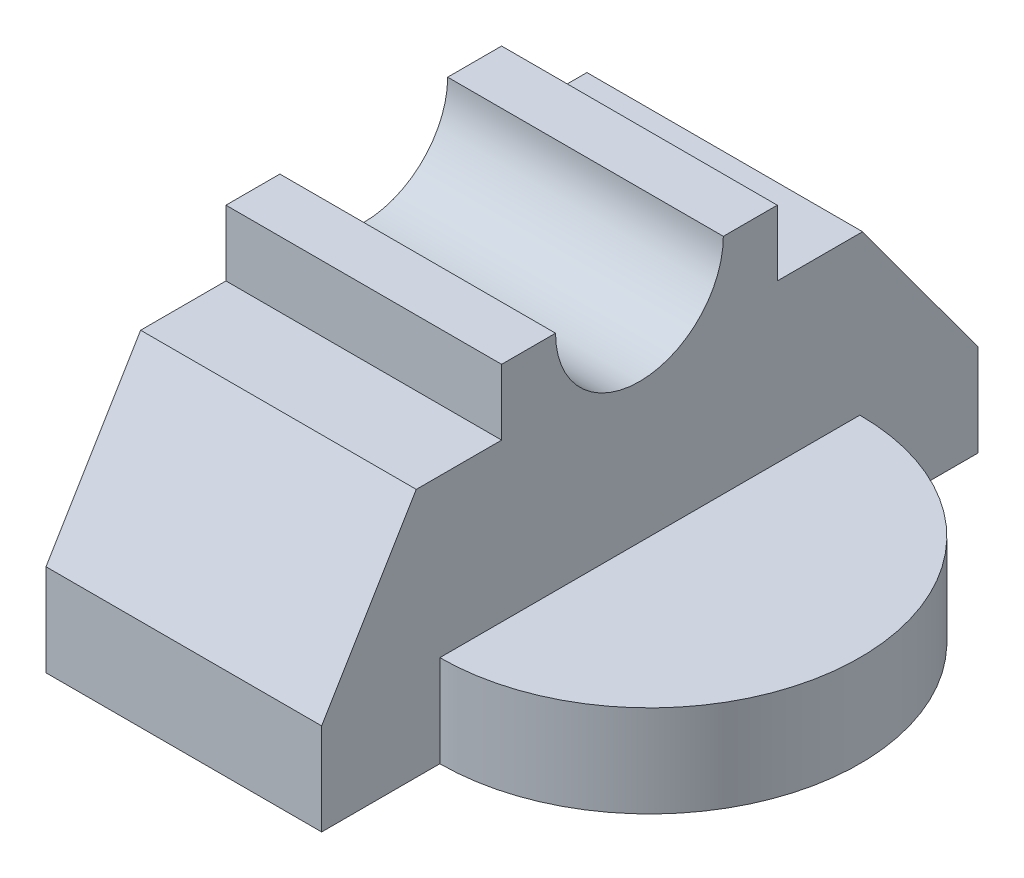
ISO-10303-21;
HEADER;
FILE_DESCRIPTION(('STEP AP214'),'2;1');
FILE_NAME('part.step','',(''),(''),'','','');
FILE_SCHEMA(('AUTOMOTIVE_DESIGN { 1 0 10303 214 1 1 1 1 }'));
ENDSEC;
DATA;
#1=APPLICATION_CONTEXT('core data for automotive mechanical design processes');
#2=APPLICATION_PROTOCOL_DEFINITION('international standard','automotive_design',2000,#1);
#3=PRODUCT_CONTEXT('',#1,'mechanical');
#4=PRODUCT('Part','Part','',(#3));
#5=PRODUCT_RELATED_PRODUCT_CATEGORY('part','',(#4));
#6=PRODUCT_DEFINITION_FORMATION('','',#4);
#7=PRODUCT_DEFINITION_CONTEXT('part definition',#1,'design');
#8=PRODUCT_DEFINITION('design','',#6,#7);
#9=PRODUCT_DEFINITION_SHAPE('','',#8);
#10=(LENGTH_UNIT() NAMED_UNIT(*) SI_UNIT(.MILLI.,.METRE.));
#11=(NAMED_UNIT(*) PLANE_ANGLE_UNIT() SI_UNIT($,.RADIAN.));
#12=(NAMED_UNIT(*) SI_UNIT($,.STERADIAN.) SOLID_ANGLE_UNIT());
#13=UNCERTAINTY_MEASURE_WITH_UNIT(LENGTH_MEASURE(1.E-05),#10,'distance_accuracy_value','');
#14=(GEOMETRIC_REPRESENTATION_CONTEXT(3) GLOBAL_UNCERTAINTY_ASSIGNED_CONTEXT((#13)) GLOBAL_UNIT_ASSIGNED_CONTEXT((#10,
#11,#12)) REPRESENTATION_CONTEXT('',''));
#15=CARTESIAN_POINT('',(0.,0.,0.));
#16=DIRECTION('',(0.,0.,1.));
#17=DIRECTION('',(1.,0.,0.));
#18=AXIS2_PLACEMENT_3D('',#15,#16,#17);
#19=CARTESIAN_POINT('',(-21.,48.,-2.55038759689925));
#20=DIRECTION('',(1.,0.,0.));
#21=DIRECTION('',(0.,0.,-1.));
#22=AXIS2_PLACEMENT_3D('',#19,#20,#21);
#23=CYLINDRICAL_SURFACE('',#22,12.7829457364341);
#24=CARTESIAN_POINT('',(0.,48.,-2.55038759689925));
#25=DIRECTION('',(1.,0.,0.));
#26=DIRECTION('',(0.,0.,-1.));
#27=AXIS2_PLACEMENT_3D('',#24,#25,#26);
#28=CIRCLE('',#27,12.7829457364341);
#29=CARTESIAN_POINT('',(0.,48.,10.2325581395349));
#30=VERTEX_POINT('',#29);
#31=CARTESIAN_POINT('',(0.,48.,-15.3333333333334));
#32=VERTEX_POINT('',#31);
#33=EDGE_CURVE('E199',#30,#32,#28,.T.);
#34=ORIENTED_EDGE('',*,*,#33,.T.);
#35=DIRECTION('',(1.,0.,0.));
#36=VECTOR('',#35,1.);
#37=CARTESIAN_POINT('',(-21.,48.,-15.3333333333334));
#38=LINE('',#37,#36);
#39=CARTESIAN_POINT('',(-42.,48.,-15.3333333333334));
#40=VERTEX_POINT('',#39);
#41=EDGE_CURVE('E11',#40,#32,#38,.T.);
#42=ORIENTED_EDGE('',*,*,#41,.F.);
#43=CARTESIAN_POINT('',(-42.,48.,-2.55038759689925));
#44=DIRECTION('',(1.,0.,0.));
#45=DIRECTION('',(0.,0.,-1.));
#46=AXIS2_PLACEMENT_3D('',#43,#44,#45);
#47=CIRCLE('',#46,12.7829457364341);
#48=CARTESIAN_POINT('',(-42.,48.,10.2325581395349));
#49=VERTEX_POINT('',#48);
#50=EDGE_CURVE('E163',#49,#40,#47,.T.);
#51=ORIENTED_EDGE('',*,*,#50,.F.);
#52=DIRECTION('',(1.,0.,0.));
#53=VECTOR('',#52,1.);
#54=CARTESIAN_POINT('',(-21.,48.,10.2325581395349));
#55=LINE('',#54,#53);
#56=EDGE_CURVE('E42',#49,#30,#55,.T.);
#57=ORIENTED_EDGE('',*,*,#56,.T.);
#58=EDGE_LOOP('',(#34,#42,#51,#57));
#59=FACE_BOUND('',#58,.T.);
#60=ADVANCED_FACE('F39',(#59),#23,.F.);
#61=CARTESIAN_POINT('',(-21.,48.,0.));
#62=DIRECTION('',(0.,1.,0.));
#63=DIRECTION('',(0.,0.,1.));
#64=AXIS2_PLACEMENT_3D('',#61,#62,#63);
#65=PLANE('',#64);
#66=DIRECTION('',(0.,0.,1.));
#67=VECTOR('',#66,1.);
#68=CARTESIAN_POINT('',(0.,48.,0.));
#69=LINE('',#68,#67);
#70=CARTESIAN_POINT('',(0.,48.,-23.5503875968993));
#71=VERTEX_POINT('',#70);
#72=EDGE_CURVE('E222',#71,#32,#69,.T.);
#73=ORIENTED_EDGE('',*,*,#72,.F.);
#74=DIRECTION('',(1.,0.,0.));
#75=VECTOR('',#74,1.);
#76=CARTESIAN_POINT('',(-21.,48.,-23.5503875968993));
#77=LINE('',#76,#75);
#78=CARTESIAN_POINT('',(-42.,48.,-23.5503875968993));
#79=VERTEX_POINT('',#78);
#80=EDGE_CURVE('E47',#79,#71,#77,.T.);
#81=ORIENTED_EDGE('',*,*,#80,.F.);
#82=DIRECTION('',(0.,0.,1.));
#83=VECTOR('',#82,1.);
#84=CARTESIAN_POINT('',(-42.,48.,0.));
#85=LINE('',#84,#83);
#86=EDGE_CURVE('E196',#79,#40,#85,.T.);
#87=ORIENTED_EDGE('',*,*,#86,.T.);
#88=ORIENTED_EDGE('',*,*,#41,.T.);
#89=EDGE_LOOP('',(#73,#81,#87,#88));
#90=FACE_BOUND('',#89,.T.);
#91=ADVANCED_FACE('F256',(#90),#65,.T.);
#92=CARTESIAN_POINT('',(-21.,0.,-23.5503875968993));
#93=DIRECTION('',(0.,0.,-1.));
#94=DIRECTION('',(-1.,0.,0.));
#95=AXIS2_PLACEMENT_3D('',#92,#93,#94);
#96=PLANE('',#95);
#97=DIRECTION('',(0.,1.,0.));
#98=VECTOR('',#97,1.);
#99=CARTESIAN_POINT('',(0.,0.,-23.5503875968993));
#100=LINE('',#99,#98);
#101=CARTESIAN_POINT('',(0.,38.,-23.5503875968993));
#102=VERTEX_POINT('',#101);
#103=EDGE_CURVE('E219',#102,#71,#100,.T.);
#104=ORIENTED_EDGE('',*,*,#103,.F.);
#105=DIRECTION('',(1.,0.,0.));
#106=VECTOR('',#105,1.);
#107=CARTESIAN_POINT('',(-21.,38.,-23.5503875968993));
#108=LINE('',#107,#106);
#109=CARTESIAN_POINT('',(-42.,38.,-23.5503875968993));
#110=VERTEX_POINT('',#109);
#111=EDGE_CURVE('E226',#110,#102,#108,.T.);
#112=ORIENTED_EDGE('',*,*,#111,.F.);
#113=DIRECTION('',(0.,1.,0.));
#114=VECTOR('',#113,1.);
#115=CARTESIAN_POINT('',(-42.,0.,-23.5503875968993));
#116=LINE('',#115,#114);
#117=EDGE_CURVE('E193',#110,#79,#116,.T.);
#118=ORIENTED_EDGE('',*,*,#117,.T.);
#119=ORIENTED_EDGE('',*,*,#80,.T.);
#120=EDGE_LOOP('',(#104,#112,#118,#119));
#121=FACE_BOUND('',#120,.T.);
#122=ADVANCED_FACE('F277',(#121),#96,.T.);
#123=CARTESIAN_POINT('',(-21.,38.,0.));
#124=DIRECTION('',(0.,1.,0.));
#125=DIRECTION('',(0.,0.,1.));
#126=AXIS2_PLACEMENT_3D('',#123,#124,#125);
#127=PLANE('',#126);
#128=DIRECTION('',(0.,0.,1.));
#129=VECTOR('',#128,1.);
#130=CARTESIAN_POINT('',(0.,38.,0.));
#131=LINE('',#130,#129);
#132=CARTESIAN_POINT('',(0.,38.,-36.5503875968993));
#133=VERTEX_POINT('',#132);
#134=EDGE_CURVE('E216',#133,#102,#131,.T.);
#135=ORIENTED_EDGE('',*,*,#134,.F.);
#136=DIRECTION('',(1.,0.,0.));
#137=VECTOR('',#136,1.);
#138=CARTESIAN_POINT('',(-21.,38.,-36.5503875968993));
#139=LINE('',#138,#137);
#140=CARTESIAN_POINT('',(-42.,38.,-36.5503875968993));
#141=VERTEX_POINT('',#140);
#142=EDGE_CURVE('E228',#141,#133,#139,.T.);
#143=ORIENTED_EDGE('',*,*,#142,.F.);
#144=DIRECTION('',(0.,0.,1.));
#145=VECTOR('',#144,1.);
#146=CARTESIAN_POINT('',(-42.,38.,0.));
#147=LINE('',#146,#145);
#148=EDGE_CURVE('E190',#141,#110,#147,.T.);
#149=ORIENTED_EDGE('',*,*,#148,.T.);
#150=ORIENTED_EDGE('',*,*,#111,.T.);
#151=EDGE_LOOP('',(#135,#143,#149,#150));
#152=FACE_BOUND('',#151,.T.);
#153=ADVANCED_FACE('F282',(#152),#127,.T.);
#154=CARTESIAN_POINT('',(-21.,30.6986030673709,-41.8998714606526));
#155=DIRECTION('',(0.,0.59101344722494,-0.806661704309368));
#156=DIRECTION('',(0.,0.806661704309368,0.59101344722494));
#157=AXIS2_PLACEMENT_3D('',#154,#155,#156);
#158=PLANE('',#157);
#159=DIRECTION('',(0.,0.806661704309368,0.59101344722494));
#160=VECTOR('',#159,1.);
#161=CARTESIAN_POINT('',(0.,30.6986030673709,-41.8998714606526));
#162=LINE('',#161,#160);
#163=CARTESIAN_POINT('',(0.,14.,-54.1343669250646));
#164=VERTEX_POINT('',#163);
#165=EDGE_CURVE('E213',#164,#133,#162,.T.);
#166=ORIENTED_EDGE('',*,*,#165,.F.);
#167=DIRECTION('',(1.,0.,0.));
#168=VECTOR('',#167,1.);
#169=CARTESIAN_POINT('',(-21.,14.,-54.1343669250646));
#170=LINE('',#169,#168);
#171=CARTESIAN_POINT('',(-42.,14.,-54.1343669250646));
#172=VERTEX_POINT('',#171);
#173=EDGE_CURVE('E230',#172,#164,#170,.T.);
#174=ORIENTED_EDGE('',*,*,#173,.F.);
#175=DIRECTION('',(0.,0.806661704309368,0.59101344722494));
#176=VECTOR('',#175,1.);
#177=CARTESIAN_POINT('',(-42.,30.6986030673709,-41.8998714606526));
#178=LINE('',#177,#176);
#179=EDGE_CURVE('E187',#172,#141,#178,.T.);
#180=ORIENTED_EDGE('',*,*,#179,.T.);
#181=ORIENTED_EDGE('',*,*,#142,.T.);
#182=EDGE_LOOP('',(#166,#174,#180,#181));
#183=FACE_BOUND('',#182,.T.);
#184=ADVANCED_FACE('F289',(#183),#158,.T.);
#185=CARTESIAN_POINT('',(-21.,0.,-54.1343669250646));
#186=DIRECTION('',(0.,0.,-1.));
#187=DIRECTION('',(-1.,0.,0.));
#188=AXIS2_PLACEMENT_3D('',#185,#186,#187);
#189=PLANE('',#188);
#190=DIRECTION('',(0.,1.,0.));
#191=VECTOR('',#190,1.);
#192=CARTESIAN_POINT('',(0.,0.,-54.1343669250646));
#193=LINE('',#192,#191);
#194=CARTESIAN_POINT('',(0.,0.,-54.1343669250646));
#195=VERTEX_POINT('',#194);
#196=EDGE_CURVE('E211',#195,#164,#193,.T.);
#197=ORIENTED_EDGE('',*,*,#196,.F.);
#198=DIRECTION('',(1.,0.,0.));
#199=VECTOR('',#198,1.);
#200=CARTESIAN_POINT('',(-21.,0.,-54.1343669250646));
#201=LINE('',#200,#199);
#202=CARTESIAN_POINT('',(-42.,0.,-54.1343669250646));
#203=VERTEX_POINT('',#202);
#204=EDGE_CURVE('E145',#203,#195,#201,.T.);
#205=ORIENTED_EDGE('',*,*,#204,.F.);
#206=DIRECTION('',(0.,1.,0.));
#207=VECTOR('',#206,1.);
#208=CARTESIAN_POINT('',(-42.,0.,-54.1343669250646));
#209=LINE('',#208,#207);
#210=EDGE_CURVE('E184',#203,#172,#209,.T.);
#211=ORIENTED_EDGE('',*,*,#210,.T.);
#212=ORIENTED_EDGE('',*,*,#173,.T.);
#213=EDGE_LOOP('',(#197,#205,#211,#212));
#214=FACE_BOUND('',#213,.T.);
#215=ADVANCED_FACE('F293',(#214),#189,.T.);
#216=CARTESIAN_POINT('',(-21.,0.,0.));
#217=DIRECTION('',(0.,-1.,0.));
#218=DIRECTION('',(0.,0.,-1.));
#219=AXIS2_PLACEMENT_3D('',#216,#217,#218);
#220=PLANE('',#219);
#221=DIRECTION('',(0.,0.,-1.));
#222=VECTOR('',#221,1.);
#223=CARTESIAN_POINT('',(0.,0.,0.));
#224=LINE('',#223,#222);
#225=CARTESIAN_POINT('',(0.,0.,45.8656330749354));
#226=VERTEX_POINT('',#225);
#227=CARTESIAN_POINT('',(0.,0.,27.8656330749354));
#228=VERTEX_POINT('',#227);
#229=EDGE_CURVE('E148',#226,#228,#224,.T.);
#230=ORIENTED_EDGE('',*,*,#229,.F.);
#231=DIRECTION('',(1.,0.,0.));
#232=VECTOR('',#231,1.);
#233=CARTESIAN_POINT('',(-21.,0.,45.8656330749354));
#234=LINE('',#233,#232);
#235=CARTESIAN_POINT('',(-42.,0.,45.8656330749354));
#236=VERTEX_POINT('',#235);
#237=EDGE_CURVE('E233',#236,#226,#234,.T.);
#238=ORIENTED_EDGE('',*,*,#237,.F.);
#239=DIRECTION('',(0.,0.,-1.));
#240=VECTOR('',#239,1.);
#241=CARTESIAN_POINT('',(-42.,0.,0.));
#242=LINE('',#241,#240);
#243=EDGE_CURVE('E182',#236,#203,#242,.T.);
#244=ORIENTED_EDGE('',*,*,#243,.T.);
#245=ORIENTED_EDGE('',*,*,#204,.T.);
#246=CARTESIAN_POINT('',(0.,0.,-36.1343669250646));
#247=VERTEX_POINT('',#246);
#248=EDGE_CURVE('E139',#247,#195,#224,.T.);
#249=ORIENTED_EDGE('',*,*,#248,.F.);
#250=CARTESIAN_POINT('',(0.,0.,-4.13436692506459));
#251=DIRECTION('',(0.,-1.,0.));
#252=DIRECTION('',(0.,0.,-1.));
#253=AXIS2_PLACEMENT_3D('',#250,#251,#252);
#254=CIRCLE('',#253,32.);
#255=EDGE_CURVE('E143',#247,#228,#254,.T.);
#256=ORIENTED_EDGE('',*,*,#255,.T.);
#257=EDGE_LOOP('',(#230,#238,#244,#245,#249,#256));
#258=FACE_BOUND('',#257,.T.);
#259=ADVANCED_FACE('F141',(#258),#220,.T.);
#260=CARTESIAN_POINT('',(-21.,0.,45.8656330749354));
#261=DIRECTION('',(0.,0.,-1.));
#262=DIRECTION('',(-1.,0.,0.));
#263=AXIS2_PLACEMENT_3D('',#260,#261,#262);
#264=PLANE('',#263);
#265=DIRECTION('',(0.,1.,0.));
#266=VECTOR('',#265,1.);
#267=CARTESIAN_POINT('',(0.,0.,45.8656330749354));
#268=LINE('',#267,#266);
#269=CARTESIAN_POINT('',(0.,14.,45.8656330749354));
#270=VERTEX_POINT('',#269);
#271=EDGE_CURVE('E149',#226,#270,#268,.T.);
#272=ORIENTED_EDGE('',*,*,#271,.T.);
#273=DIRECTION('',(1.,0.,0.));
#274=VECTOR('',#273,1.);
#275=CARTESIAN_POINT('',(-21.,14.,45.8656330749354));
#276=LINE('',#275,#274);
#277=CARTESIAN_POINT('',(-42.,14.,45.8656330749354));
#278=VERTEX_POINT('',#277);
#279=EDGE_CURVE('E235',#278,#270,#276,.T.);
#280=ORIENTED_EDGE('',*,*,#279,.F.);
#281=DIRECTION('',(0.,1.,0.));
#282=VECTOR('',#281,1.);
#283=CARTESIAN_POINT('',(-42.,0.,45.8656330749354));
#284=LINE('',#283,#282);
#285=EDGE_CURVE('E179',#236,#278,#284,.T.);
#286=ORIENTED_EDGE('',*,*,#285,.F.);
#287=ORIENTED_EDGE('',*,*,#237,.T.);
#288=EDGE_LOOP('',(#272,#280,#286,#287));
#289=FACE_BOUND('',#288,.T.);
#290=ADVANCED_FACE('F300',(#289),#264,.F.);
#291=CARTESIAN_POINT('',(-21.,23.9573645724373,39.8845675118833));
#292=DIRECTION('',(0.,-0.514916452270374,-0.857240367214057));
#293=DIRECTION('',(0.,0.857240367214057,-0.514916452270374));
#294=AXIS2_PLACEMENT_3D('',#291,#292,#293);
#295=PLANE('',#294);
#296=DIRECTION('',(0.,0.857240367214057,-0.514916452270374));
#297=VECTOR('',#296,1.);
#298=CARTESIAN_POINT('',(0.,23.9573645724373,39.8845675118833));
#299=LINE('',#298,#297);
#300=CARTESIAN_POINT('',(0.,38.,31.4496124031008));
#301=VERTEX_POINT('',#300);
#302=EDGE_CURVE('E208',#270,#301,#299,.T.);
#303=ORIENTED_EDGE('',*,*,#302,.T.);
#304=DIRECTION('',(1.,0.,0.));
#305=VECTOR('',#304,1.);
#306=CARTESIAN_POINT('',(-21.,38.,31.4496124031008));
#307=LINE('',#306,#305);
#308=CARTESIAN_POINT('',(-42.,38.,31.4496124031008));
#309=VERTEX_POINT('',#308);
#310=EDGE_CURVE('E238',#309,#301,#307,.T.);
#311=ORIENTED_EDGE('',*,*,#310,.F.);
#312=DIRECTION('',(0.,0.857240367214057,-0.514916452270374));
#313=VECTOR('',#312,1.);
#314=CARTESIAN_POINT('',(-42.,23.9573645724373,39.8845675118833));
#315=LINE('',#314,#313);
#316=EDGE_CURVE('E176',#278,#309,#315,.T.);
#317=ORIENTED_EDGE('',*,*,#316,.F.);
#318=ORIENTED_EDGE('',*,*,#279,.T.);
#319=EDGE_LOOP('',(#303,#311,#317,#318));
#320=FACE_BOUND('',#319,.T.);
#321=ADVANCED_FACE('F303',(#320),#295,.F.);
#322=CARTESIAN_POINT('',(-21.,38.,0.));
#323=DIRECTION('',(0.,-1.,0.));
#324=DIRECTION('',(0.,0.,-1.));
#325=AXIS2_PLACEMENT_3D('',#322,#323,#324);
#326=PLANE('',#325);
#327=DIRECTION('',(0.,0.,-1.));
#328=VECTOR('',#327,1.);
#329=CARTESIAN_POINT('',(0.,38.,0.));
#330=LINE('',#329,#328);
#331=CARTESIAN_POINT('',(0.,38.,18.4496124031008));
#332=VERTEX_POINT('',#331);
#333=EDGE_CURVE('E206',#301,#332,#330,.T.);
#334=ORIENTED_EDGE('',*,*,#333,.T.);
#335=DIRECTION('',(1.,0.,0.));
#336=VECTOR('',#335,1.);
#337=CARTESIAN_POINT('',(-21.,38.,18.4496124031008));
#338=LINE('',#337,#336);
#339=CARTESIAN_POINT('',(-42.,38.,18.4496124031008));
#340=VERTEX_POINT('',#339);
#341=EDGE_CURVE('E241',#340,#332,#338,.T.);
#342=ORIENTED_EDGE('',*,*,#341,.F.);
#343=DIRECTION('',(0.,0.,-1.));
#344=VECTOR('',#343,1.);
#345=CARTESIAN_POINT('',(-42.,38.,0.));
#346=LINE('',#345,#344);
#347=EDGE_CURVE('E173',#309,#340,#346,.T.);
#348=ORIENTED_EDGE('',*,*,#347,.F.);
#349=ORIENTED_EDGE('',*,*,#310,.T.);
#350=EDGE_LOOP('',(#334,#342,#348,#349));
#351=FACE_BOUND('',#350,.T.);
#352=ADVANCED_FACE('F270',(#351),#326,.F.);
#353=CARTESIAN_POINT('',(-21.,0.,18.4496124031008));
#354=DIRECTION('',(0.,0.,-1.));
#355=DIRECTION('',(-1.,0.,0.));
#356=AXIS2_PLACEMENT_3D('',#353,#354,#355);
#357=PLANE('',#356);
#358=DIRECTION('',(0.,1.,0.));
#359=VECTOR('',#358,1.);
#360=CARTESIAN_POINT('',(0.,0.,18.4496124031008));
#361=LINE('',#360,#359);
#362=CARTESIAN_POINT('',(0.,48.,18.4496124031008));
#363=VERTEX_POINT('',#362);
#364=EDGE_CURVE('E204',#332,#363,#361,.T.);
#365=ORIENTED_EDGE('',*,*,#364,.T.);
#366=DIRECTION('',(1.,0.,0.));
#367=VECTOR('',#366,1.);
#368=CARTESIAN_POINT('',(-21.,48.,18.4496124031008));
#369=LINE('',#368,#367);
#370=CARTESIAN_POINT('',(-42.,48.,18.4496124031008));
#371=VERTEX_POINT('',#370);
#372=EDGE_CURVE('E243',#371,#363,#369,.T.);
#373=ORIENTED_EDGE('',*,*,#372,.F.);
#374=DIRECTION('',(0.,1.,0.));
#375=VECTOR('',#374,1.);
#376=CARTESIAN_POINT('',(-42.,0.,18.4496124031008));
#377=LINE('',#376,#375);
#378=EDGE_CURVE('E170',#340,#371,#377,.T.);
#379=ORIENTED_EDGE('',*,*,#378,.F.);
#380=ORIENTED_EDGE('',*,*,#341,.T.);
#381=EDGE_LOOP('',(#365,#373,#379,#380));
#382=FACE_BOUND('',#381,.T.);
#383=ADVANCED_FACE('F264',(#382),#357,.F.);
#384=CARTESIAN_POINT('',(-21.,48.,0.));
#385=DIRECTION('',(0.,-1.,0.));
#386=DIRECTION('',(0.,0.,-1.));
#387=AXIS2_PLACEMENT_3D('',#384,#385,#386);
#388=PLANE('',#387);
#389=DIRECTION('',(0.,0.,-1.));
#390=VECTOR('',#389,1.);
#391=CARTESIAN_POINT('',(0.,48.,0.));
#392=LINE('',#391,#390);
#393=EDGE_CURVE('E202',#363,#30,#392,.T.);
#394=ORIENTED_EDGE('',*,*,#393,.T.);
#395=ORIENTED_EDGE('',*,*,#56,.F.);
#396=DIRECTION('',(0.,0.,-1.));
#397=VECTOR('',#396,1.);
#398=CARTESIAN_POINT('',(-42.,48.,0.));
#399=LINE('',#398,#397);
#400=EDGE_CURVE('E167',#371,#49,#399,.T.);
#401=ORIENTED_EDGE('',*,*,#400,.F.);
#402=ORIENTED_EDGE('',*,*,#372,.T.);
#403=EDGE_LOOP('',(#394,#395,#401,#402));
#404=FACE_BOUND('',#403,.T.);
#405=ADVANCED_FACE('F262',(#404),#388,.F.);
#406=CARTESIAN_POINT('',(0.,0.,0.));
#407=DIRECTION('',(1.,0.,0.));
#408=DIRECTION('',(0.,0.,-1.));
#409=AXIS2_PLACEMENT_3D('',#406,#407,#408);
#410=PLANE('',#409);
#411=DIRECTION('',(0.,-1.,0.));
#412=VECTOR('',#411,1.);
#413=CARTESIAN_POINT('',(0.,14.,27.8656330749354));
#414=LINE('',#413,#412);
#415=CARTESIAN_POINT('',(0.,14.,27.8656330749354));
#416=VERTEX_POINT('',#415);
#417=EDGE_CURVE('E60',#416,#228,#414,.T.);
#418=ORIENTED_EDGE('',*,*,#417,.F.);
#419=DIRECTION('',(0.,0.,1.));
#420=VECTOR('',#419,1.);
#421=CARTESIAN_POINT('',(0.,14.,0.));
#422=LINE('',#421,#420);
#423=CARTESIAN_POINT('',(0.,14.,-36.1343669250646));
#424=VERTEX_POINT('',#423);
#425=EDGE_CURVE('E55',#424,#416,#422,.T.);
#426=ORIENTED_EDGE('',*,*,#425,.F.);
#427=DIRECTION('',(0.,-1.,0.));
#428=VECTOR('',#427,1.);
#429=CARTESIAN_POINT('',(0.,14.,-36.1343669250646));
#430=LINE('',#429,#428);
#431=EDGE_CURVE('E151',#424,#247,#430,.T.);
#432=ORIENTED_EDGE('',*,*,#431,.T.);
#433=ORIENTED_EDGE('',*,*,#248,.T.);
#434=ORIENTED_EDGE('',*,*,#196,.T.);
#435=ORIENTED_EDGE('',*,*,#165,.T.);
#436=ORIENTED_EDGE('',*,*,#134,.T.);
#437=ORIENTED_EDGE('',*,*,#103,.T.);
#438=ORIENTED_EDGE('',*,*,#72,.T.);
#439=ORIENTED_EDGE('',*,*,#33,.F.);
#440=ORIENTED_EDGE('',*,*,#393,.F.);
#441=ORIENTED_EDGE('',*,*,#364,.F.);
#442=ORIENTED_EDGE('',*,*,#333,.F.);
#443=ORIENTED_EDGE('',*,*,#302,.F.);
#444=ORIENTED_EDGE('',*,*,#271,.F.);
#445=ORIENTED_EDGE('',*,*,#229,.T.);
#446=EDGE_LOOP('',(#418,#426,#432,#433,#434,#435,#436,#437,#438,#439,#440,#441,#442,#443,#444,#445));
#447=FACE_BOUND('',#446,.T.);
#448=ADVANCED_FACE('F152',(#447),#410,.T.);
#449=CARTESIAN_POINT('',(-42.,0.,0.));
#450=DIRECTION('',(-1.,0.,0.));
#451=DIRECTION('',(0.,0.,-1.));
#452=AXIS2_PLACEMENT_3D('',#449,#450,#451);
#453=PLANE('',#452);
#454=ORIENTED_EDGE('',*,*,#50,.T.);
#455=ORIENTED_EDGE('',*,*,#86,.F.);
#456=ORIENTED_EDGE('',*,*,#117,.F.);
#457=ORIENTED_EDGE('',*,*,#148,.F.);
#458=ORIENTED_EDGE('',*,*,#179,.F.);
#459=ORIENTED_EDGE('',*,*,#210,.F.);
#460=ORIENTED_EDGE('',*,*,#243,.F.);
#461=ORIENTED_EDGE('',*,*,#285,.T.);
#462=ORIENTED_EDGE('',*,*,#316,.T.);
#463=ORIENTED_EDGE('',*,*,#347,.T.);
#464=ORIENTED_EDGE('',*,*,#378,.T.);
#465=ORIENTED_EDGE('',*,*,#400,.T.);
#466=EDGE_LOOP('',(#454,#455,#456,#457,#458,#459,#460,#461,#462,#463,#464,#465));
#467=FACE_BOUND('',#466,.T.);
#468=ADVANCED_FACE('F260',(#467),#453,.T.);
#469=CARTESIAN_POINT('',(0.,14.,-4.13436692506459));
#470=DIRECTION('',(0.,-1.,0.));
#471=DIRECTION('',(0.,0.,-1.));
#472=AXIS2_PLACEMENT_3D('',#469,#470,#471);
#473=CYLINDRICAL_SURFACE('',#472,32.);
#474=ORIENTED_EDGE('',*,*,#255,.F.);
#475=ORIENTED_EDGE('',*,*,#431,.F.);
#476=CARTESIAN_POINT('',(0.,14.,-4.13436692506459));
#477=DIRECTION('',(0.,-1.,0.));
#478=DIRECTION('',(0.,0.,-1.));
#479=AXIS2_PLACEMENT_3D('',#476,#477,#478);
#480=CIRCLE('',#479,32.);
#481=EDGE_CURVE('E156',#424,#416,#480,.T.);
#482=ORIENTED_EDGE('',*,*,#481,.T.);
#483=ORIENTED_EDGE('',*,*,#417,.T.);
#484=EDGE_LOOP('',(#474,#475,#482,#483));
#485=FACE_BOUND('',#484,.T.);
#486=ADVANCED_FACE('F158',(#485),#473,.T.);
#487=CARTESIAN_POINT('',(0.,14.,0.));
#488=DIRECTION('',(0.,-1.,0.));
#489=DIRECTION('',(0.,0.,-1.));
#490=AXIS2_PLACEMENT_3D('',#487,#488,#489);
#491=PLANE('',#490);
#492=ORIENTED_EDGE('',*,*,#425,.T.);
#493=ORIENTED_EDGE('',*,*,#481,.F.);
#494=EDGE_LOOP('',(#492,#493));
#495=FACE_BOUND('',#494,.T.);
#496=ADVANCED_FACE('F366',(#495),#491,.F.);
#497=CLOSED_SHELL('',(#60,#91,#122,#153,#184,#215,#259,#290,#321,#352,#383,#405,#448,#468,#486,#496));
#498=MANIFOLD_SOLID_BREP('B2',#497);
#499=ADVANCED_BREP_SHAPE_REPRESENTATION('',(#18,#498),#14);
#500=SHAPE_DEFINITION_REPRESENTATION(#9,#499);
ENDSEC;
END-ISO-10303-21;
